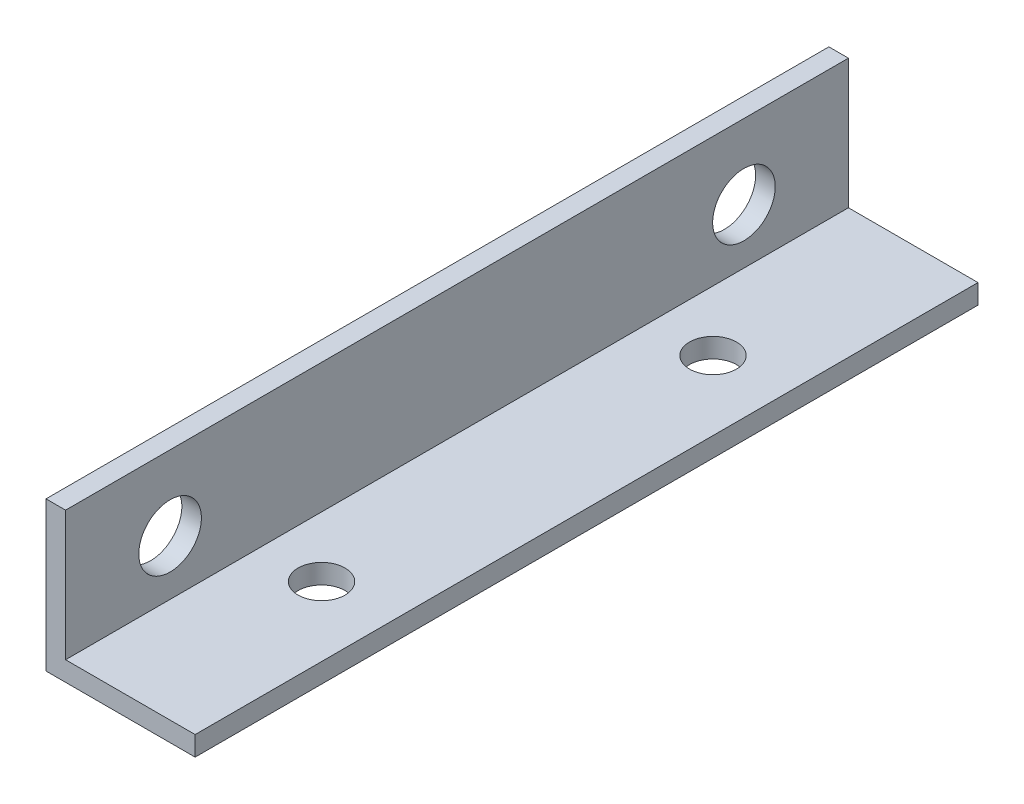
ISO-10303-21;
HEADER;
FILE_DESCRIPTION(('STEP AP214'),'2;1');
FILE_NAME('part.step','',(''),(''),'','','');
FILE_SCHEMA(('AUTOMOTIVE_DESIGN { 1 0 10303 214 1 1 1 1 }'));
ENDSEC;
DATA;
#1=APPLICATION_CONTEXT('core data for automotive mechanical design processes');
#2=APPLICATION_PROTOCOL_DEFINITION('international standard','automotive_design',2000,#1);
#3=PRODUCT_CONTEXT('',#1,'mechanical');
#4=PRODUCT('Part','Part','',(#3));
#5=PRODUCT_RELATED_PRODUCT_CATEGORY('part','',(#4));
#6=PRODUCT_DEFINITION_FORMATION('','',#4);
#7=PRODUCT_DEFINITION_CONTEXT('part definition',#1,'design');
#8=PRODUCT_DEFINITION('design','',#6,#7);
#9=PRODUCT_DEFINITION_SHAPE('','',#8);
#10=(LENGTH_UNIT() NAMED_UNIT(*) SI_UNIT(.MILLI.,.METRE.));
#11=(NAMED_UNIT(*) PLANE_ANGLE_UNIT() SI_UNIT($,.RADIAN.));
#12=(NAMED_UNIT(*) SI_UNIT($,.STERADIAN.) SOLID_ANGLE_UNIT());
#13=UNCERTAINTY_MEASURE_WITH_UNIT(LENGTH_MEASURE(1.E-05),#10,'distance_accuracy_value','');
#14=(GEOMETRIC_REPRESENTATION_CONTEXT(3) GLOBAL_UNCERTAINTY_ASSIGNED_CONTEXT((#13)) GLOBAL_UNIT_ASSIGNED_CONTEXT((#10,
#11,#12)) REPRESENTATION_CONTEXT('',''));
#15=CARTESIAN_POINT('',(0.,0.,0.));
#16=DIRECTION('',(0.,0.,1.));
#17=DIRECTION('',(1.,0.,0.));
#18=AXIS2_PLACEMENT_3D('',#15,#16,#17);
#19=CARTESIAN_POINT('',(2.5,0.,50.));
#20=DIRECTION('',(-1.,0.,0.));
#21=DIRECTION('',(0.,0.,1.));
#22=AXIS2_PLACEMENT_3D('',#19,#20,#21);
#23=PLANE('',#22);
#24=CARTESIAN_POINT('',(2.5,9.52500000000001,36.65));
#25=DIRECTION('',(-1.,0.,0.));
#26=DIRECTION('',(0.,0.,1.));
#27=AXIS2_PLACEMENT_3D('',#24,#25,#26);
#28=CIRCLE('',#27,3.99999999999999);
#29=CARTESIAN_POINT('',(2.5,9.52500000000001,40.65));
#30=VERTEX_POINT('',#29);
#31=EDGE_CURVE('E152',#30,#30,#28,.F.);
#32=ORIENTED_EDGE('',*,*,#31,.F.);
#33=EDGE_LOOP('',(#32));
#34=FACE_BOUND('',#33,.T.);
#35=CARTESIAN_POINT('',(2.5,9.52500000000001,-36.65));
#36=DIRECTION('',(-1.,0.,0.));
#37=DIRECTION('',(0.,0.,1.));
#38=AXIS2_PLACEMENT_3D('',#35,#36,#37);
#39=CIRCLE('',#38,3.99999999999999);
#40=CARTESIAN_POINT('',(2.5,9.52500000000001,-32.65));
#41=VERTEX_POINT('',#40);
#42=EDGE_CURVE('E122',#41,#41,#39,.F.);
#43=ORIENTED_EDGE('',*,*,#42,.F.);
#44=EDGE_LOOP('',(#43));
#45=FACE_BOUND('',#44,.T.);
#46=DIRECTION('',(0.,1.,0.));
#47=VECTOR('',#46,1.);
#48=CARTESIAN_POINT('',(2.5,0.,-50.));
#49=LINE('',#48,#47);
#50=CARTESIAN_POINT('',(2.5,2.5,-50.));
#51=VERTEX_POINT('',#50);
#52=CARTESIAN_POINT('',(2.5,19.05,-50.));
#53=VERTEX_POINT('',#52);
#54=EDGE_CURVE('E118',#51,#53,#49,.T.);
#55=ORIENTED_EDGE('',*,*,#54,.T.);
#56=DIRECTION('',(0.,0.,-1.));
#57=VECTOR('',#56,1.);
#58=CARTESIAN_POINT('',(2.5,19.05,50.));
#59=LINE('',#58,#57);
#60=CARTESIAN_POINT('',(2.5,19.05,50.));
#61=VERTEX_POINT('',#60);
#62=EDGE_CURVE('E11',#61,#53,#59,.T.);
#63=ORIENTED_EDGE('',*,*,#62,.F.);
#64=DIRECTION('',(0.,1.,0.));
#65=VECTOR('',#64,1.);
#66=CARTESIAN_POINT('',(2.5,0.,50.));
#67=LINE('',#66,#65);
#68=CARTESIAN_POINT('',(2.5,2.5,50.));
#69=VERTEX_POINT('',#68);
#70=EDGE_CURVE('E83',#69,#61,#67,.T.);
#71=ORIENTED_EDGE('',*,*,#70,.F.);
#72=DIRECTION('',(0.,0.,-1.));
#73=VECTOR('',#72,1.);
#74=CARTESIAN_POINT('',(2.5,2.5,50.));
#75=LINE('',#74,#73);
#76=EDGE_CURVE('E114',#69,#51,#75,.T.);
#77=ORIENTED_EDGE('',*,*,#76,.T.);
#78=EDGE_LOOP('',(#55,#63,#71,#77));
#79=FACE_BOUND('',#78,.T.);
#80=ADVANCED_FACE('F35',(#34,#45,#79),#23,.F.);
#81=CARTESIAN_POINT('',(0.,19.05,50.));
#82=DIRECTION('',(0.,1.,0.));
#83=DIRECTION('',(0.,0.,1.));
#84=AXIS2_PLACEMENT_3D('',#81,#82,#83);
#85=PLANE('',#84);
#86=DIRECTION('',(1.,0.,0.));
#87=VECTOR('',#86,1.);
#88=CARTESIAN_POINT('',(0.,19.05,-50.));
#89=LINE('',#88,#87);
#90=CARTESIAN_POINT('',(0.,19.05,-50.));
#91=VERTEX_POINT('',#90);
#92=EDGE_CURVE('E121',#91,#53,#89,.T.);
#93=ORIENTED_EDGE('',*,*,#92,.F.);
#94=DIRECTION('',(0.,0.,-1.));
#95=VECTOR('',#94,1.);
#96=CARTESIAN_POINT('',(0.,19.05,50.));
#97=LINE('',#96,#95);
#98=CARTESIAN_POINT('',(0.,19.05,50.));
#99=VERTEX_POINT('',#98);
#100=EDGE_CURVE('E44',#99,#91,#97,.T.);
#101=ORIENTED_EDGE('',*,*,#100,.F.);
#102=DIRECTION('',(1.,0.,0.));
#103=VECTOR('',#102,1.);
#104=CARTESIAN_POINT('',(0.,19.05,50.));
#105=LINE('',#104,#103);
#106=EDGE_CURVE('E161',#99,#61,#105,.T.);
#107=ORIENTED_EDGE('',*,*,#106,.T.);
#108=ORIENTED_EDGE('',*,*,#62,.T.);
#109=EDGE_LOOP('',(#93,#101,#107,#108));
#110=FACE_BOUND('',#109,.T.);
#111=ADVANCED_FACE('F185',(#110),#85,.T.);
#112=CARTESIAN_POINT('',(0.,0.,50.));
#113=DIRECTION('',(-1.,0.,0.));
#114=DIRECTION('',(0.,0.,1.));
#115=AXIS2_PLACEMENT_3D('',#112,#113,#114);
#116=PLANE('',#115);
#117=CARTESIAN_POINT('',(0.,9.52500000000001,36.65));
#118=DIRECTION('',(-1.,0.,0.));
#119=DIRECTION('',(0.,0.,1.));
#120=AXIS2_PLACEMENT_3D('',#117,#118,#119);
#121=CIRCLE('',#120,3.99999999999999);
#122=CARTESIAN_POINT('',(0.,9.52500000000001,40.65));
#123=VERTEX_POINT('',#122);
#124=EDGE_CURVE('E141',#123,#123,#121,.T.);
#125=ORIENTED_EDGE('',*,*,#124,.F.);
#126=EDGE_LOOP('',(#125));
#127=FACE_BOUND('',#126,.T.);
#128=CARTESIAN_POINT('',(0.,9.52500000000001,-36.65));
#129=DIRECTION('',(-1.,0.,0.));
#130=DIRECTION('',(0.,0.,1.));
#131=AXIS2_PLACEMENT_3D('',#128,#129,#130);
#132=CIRCLE('',#131,3.99999999999999);
#133=CARTESIAN_POINT('',(0.,9.52500000000001,-32.65));
#134=VERTEX_POINT('',#133);
#135=EDGE_CURVE('E155',#134,#134,#132,.T.);
#136=ORIENTED_EDGE('',*,*,#135,.F.);
#137=EDGE_LOOP('',(#136));
#138=FACE_BOUND('',#137,.T.);
#139=DIRECTION('',(0.,1.,0.));
#140=VECTOR('',#139,1.);
#141=CARTESIAN_POINT('',(0.,0.,-50.));
#142=LINE('',#141,#140);
#143=CARTESIAN_POINT('',(0.,0.,-50.));
#144=VERTEX_POINT('',#143);
#145=EDGE_CURVE('E125',#144,#91,#142,.T.);
#146=ORIENTED_EDGE('',*,*,#145,.F.);
#147=DIRECTION('',(0.,0.,-1.));
#148=VECTOR('',#147,1.);
#149=CARTESIAN_POINT('',(0.,0.,50.));
#150=LINE('',#149,#148);
#151=CARTESIAN_POINT('',(0.,0.,50.));
#152=VERTEX_POINT('',#151);
#153=EDGE_CURVE('E104',#152,#144,#150,.T.);
#154=ORIENTED_EDGE('',*,*,#153,.F.);
#155=DIRECTION('',(0.,1.,0.));
#156=VECTOR('',#155,1.);
#157=CARTESIAN_POINT('',(0.,0.,50.));
#158=LINE('',#157,#156);
#159=EDGE_CURVE('E110',#152,#99,#158,.T.);
#160=ORIENTED_EDGE('',*,*,#159,.T.);
#161=ORIENTED_EDGE('',*,*,#100,.T.);
#162=EDGE_LOOP('',(#146,#154,#160,#161));
#163=FACE_BOUND('',#162,.T.);
#164=ADVANCED_FACE('F165',(#127,#138,#163),#116,.T.);
#165=CARTESIAN_POINT('',(19.05,0.,50.));
#166=DIRECTION('',(0.,-1.,0.));
#167=DIRECTION('',(0.,0.,-1.));
#168=AXIS2_PLACEMENT_3D('',#165,#166,#167);
#169=PLANE('',#168);
#170=CARTESIAN_POINT('',(10.2,0.,25.));
#171=DIRECTION('',(0.,-1.,0.));
#172=DIRECTION('',(0.,0.,-1.));
#173=AXIS2_PLACEMENT_3D('',#170,#171,#172);
#174=CIRCLE('',#173,3.);
#175=CARTESIAN_POINT('',(10.2,0.,22.));
#176=VERTEX_POINT('',#175);
#177=EDGE_CURVE('E137',#176,#176,#174,.T.);
#178=ORIENTED_EDGE('',*,*,#177,.F.);
#179=EDGE_LOOP('',(#178));
#180=FACE_BOUND('',#179,.T.);
#181=CARTESIAN_POINT('',(10.2,0.,-25.));
#182=DIRECTION('',(0.,-1.,0.));
#183=DIRECTION('',(0.,0.,-1.));
#184=AXIS2_PLACEMENT_3D('',#181,#182,#183);
#185=CIRCLE('',#184,3.);
#186=CARTESIAN_POINT('',(10.2,0.,-28.));
#187=VERTEX_POINT('',#186);
#188=EDGE_CURVE('E143',#187,#187,#185,.T.);
#189=ORIENTED_EDGE('',*,*,#188,.F.);
#190=EDGE_LOOP('',(#189));
#191=FACE_BOUND('',#190,.T.);
#192=DIRECTION('',(-1.,0.,0.));
#193=VECTOR('',#192,1.);
#194=CARTESIAN_POINT('',(19.05,0.,-50.));
#195=LINE('',#194,#193);
#196=CARTESIAN_POINT('',(19.05,0.,-50.));
#197=VERTEX_POINT('',#196);
#198=EDGE_CURVE('E99',#197,#144,#195,.T.);
#199=ORIENTED_EDGE('',*,*,#198,.F.);
#200=DIRECTION('',(0.,0.,-1.));
#201=VECTOR('',#200,1.);
#202=CARTESIAN_POINT('',(19.05,0.,50.));
#203=LINE('',#202,#201);
#204=CARTESIAN_POINT('',(19.05,0.,50.));
#205=VERTEX_POINT('',#204);
#206=EDGE_CURVE('E94',#205,#197,#203,.T.);
#207=ORIENTED_EDGE('',*,*,#206,.F.);
#208=DIRECTION('',(-1.,0.,0.));
#209=VECTOR('',#208,1.);
#210=CARTESIAN_POINT('',(19.05,0.,50.));
#211=LINE('',#210,#209);
#212=EDGE_CURVE('E97',#205,#152,#211,.T.);
#213=ORIENTED_EDGE('',*,*,#212,.T.);
#214=ORIENTED_EDGE('',*,*,#153,.T.);
#215=EDGE_LOOP('',(#199,#207,#213,#214));
#216=FACE_BOUND('',#215,.T.);
#217=ADVANCED_FACE('F96',(#180,#191,#216),#169,.T.);
#218=CARTESIAN_POINT('',(19.05,2.5,50.));
#219=DIRECTION('',(1.,0.,0.));
#220=DIRECTION('',(0.,0.,-1.));
#221=AXIS2_PLACEMENT_3D('',#218,#219,#220);
#222=PLANE('',#221);
#223=DIRECTION('',(0.,-1.,0.));
#224=VECTOR('',#223,1.);
#225=CARTESIAN_POINT('',(19.05,2.5,-50.));
#226=LINE('',#225,#224);
#227=CARTESIAN_POINT('',(19.05,2.5,-50.));
#228=VERTEX_POINT('',#227);
#229=EDGE_CURVE('E129',#228,#197,#226,.T.);
#230=ORIENTED_EDGE('',*,*,#229,.F.);
#231=DIRECTION('',(0.,0.,-1.));
#232=VECTOR('',#231,1.);
#233=CARTESIAN_POINT('',(19.05,2.5,50.));
#234=LINE('',#233,#232);
#235=CARTESIAN_POINT('',(19.05,2.5,50.));
#236=VERTEX_POINT('',#235);
#237=EDGE_CURVE('E74',#236,#228,#234,.T.);
#238=ORIENTED_EDGE('',*,*,#237,.F.);
#239=DIRECTION('',(0.,-1.,0.));
#240=VECTOR('',#239,1.);
#241=CARTESIAN_POINT('',(19.05,2.5,50.));
#242=LINE('',#241,#240);
#243=EDGE_CURVE('E108',#236,#205,#242,.T.);
#244=ORIENTED_EDGE('',*,*,#243,.T.);
#245=ORIENTED_EDGE('',*,*,#206,.T.);
#246=EDGE_LOOP('',(#230,#238,#244,#245));
#247=FACE_BOUND('',#246,.T.);
#248=ADVANCED_FACE('F112',(#247),#222,.T.);
#249=CARTESIAN_POINT('',(19.05,2.5,50.));
#250=DIRECTION('',(0.,-1.,0.));
#251=DIRECTION('',(0.,0.,-1.));
#252=AXIS2_PLACEMENT_3D('',#249,#250,#251);
#253=PLANE('',#252);
#254=CARTESIAN_POINT('',(10.2,2.5,25.));
#255=DIRECTION('',(0.,-1.,0.));
#256=DIRECTION('',(0.,0.,-1.));
#257=AXIS2_PLACEMENT_3D('',#254,#255,#256);
#258=CIRCLE('',#257,3.);
#259=CARTESIAN_POINT('',(10.2,2.5,22.));
#260=VERTEX_POINT('',#259);
#261=EDGE_CURVE('E38',#260,#260,#258,.T.);
#262=ORIENTED_EDGE('',*,*,#261,.T.);
#263=EDGE_LOOP('',(#262));
#264=FACE_BOUND('',#263,.T.);
#265=CARTESIAN_POINT('',(10.2,2.5,-25.));
#266=DIRECTION('',(0.,-1.,0.));
#267=DIRECTION('',(0.,0.,-1.));
#268=AXIS2_PLACEMENT_3D('',#265,#266,#267);
#269=CIRCLE('',#268,3.);
#270=CARTESIAN_POINT('',(10.2,2.5,-28.));
#271=VERTEX_POINT('',#270);
#272=EDGE_CURVE('E135',#271,#271,#269,.T.);
#273=ORIENTED_EDGE('',*,*,#272,.T.);
#274=EDGE_LOOP('',(#273));
#275=FACE_BOUND('',#274,.T.);
#276=DIRECTION('',(1.,0.,0.));
#277=VECTOR('',#276,1.);
#278=CARTESIAN_POINT('',(19.05,2.5,-50.));
#279=LINE('',#278,#277);
#280=EDGE_CURVE('E77',#228,#51,#279,.F.);
#281=ORIENTED_EDGE('',*,*,#280,.T.);
#282=ORIENTED_EDGE('',*,*,#76,.F.);
#283=DIRECTION('',(1.,0.,0.));
#284=VECTOR('',#283,1.);
#285=CARTESIAN_POINT('',(19.05,2.5,50.));
#286=LINE('',#285,#284);
#287=EDGE_CURVE('E53',#236,#69,#286,.F.);
#288=ORIENTED_EDGE('',*,*,#287,.F.);
#289=ORIENTED_EDGE('',*,*,#237,.T.);
#290=EDGE_LOOP('',(#281,#282,#288,#289));
#291=FACE_BOUND('',#290,.T.);
#292=ADVANCED_FACE('F171',(#264,#275,#291),#253,.F.);
#293=CARTESIAN_POINT('',(0.,0.,50.));
#294=DIRECTION('',(0.,0.,-1.));
#295=DIRECTION('',(-1.,0.,0.));
#296=AXIS2_PLACEMENT_3D('',#293,#294,#295);
#297=PLANE('',#296);
#298=ORIENTED_EDGE('',*,*,#70,.T.);
#299=ORIENTED_EDGE('',*,*,#106,.F.);
#300=ORIENTED_EDGE('',*,*,#159,.F.);
#301=ORIENTED_EDGE('',*,*,#212,.F.);
#302=ORIENTED_EDGE('',*,*,#243,.F.);
#303=ORIENTED_EDGE('',*,*,#287,.T.);
#304=EDGE_LOOP('',(#298,#299,#300,#301,#302,#303));
#305=FACE_BOUND('',#304,.T.);
#306=ADVANCED_FACE('F107',(#305),#297,.F.);
#307=CARTESIAN_POINT('',(0.,0.,-50.));
#308=DIRECTION('',(0.,0.,-1.));
#309=DIRECTION('',(-1.,0.,0.));
#310=AXIS2_PLACEMENT_3D('',#307,#308,#309);
#311=PLANE('',#310);
#312=ORIENTED_EDGE('',*,*,#54,.F.);
#313=ORIENTED_EDGE('',*,*,#280,.F.);
#314=ORIENTED_EDGE('',*,*,#229,.T.);
#315=ORIENTED_EDGE('',*,*,#198,.T.);
#316=ORIENTED_EDGE('',*,*,#145,.T.);
#317=ORIENTED_EDGE('',*,*,#92,.T.);
#318=EDGE_LOOP('',(#312,#313,#314,#315,#316,#317));
#319=FACE_BOUND('',#318,.T.);
#320=ADVANCED_FACE('F169',(#319),#311,.T.);
#321=CARTESIAN_POINT('',(19.051,9.52500000000001,-36.65));
#322=DIRECTION('',(-1.,0.,0.));
#323=DIRECTION('',(0.,0.,1.));
#324=AXIS2_PLACEMENT_3D('',#321,#322,#323);
#325=CYLINDRICAL_SURFACE('',#324,3.99999999999999);
#326=ORIENTED_EDGE('',*,*,#135,.T.);
#327=EDGE_LOOP('',(#326));
#328=FACE_BOUND('',#327,.T.);
#329=ORIENTED_EDGE('',*,*,#42,.T.);
#330=EDGE_LOOP('',(#329));
#331=FACE_BOUND('',#330,.T.);
#332=ADVANCED_FACE('F195',(#328,#331),#325,.F.);
#333=CARTESIAN_POINT('',(19.051,9.52500000000001,36.65));
#334=DIRECTION('',(-1.,0.,0.));
#335=DIRECTION('',(0.,0.,1.));
#336=AXIS2_PLACEMENT_3D('',#333,#334,#335);
#337=CYLINDRICAL_SURFACE('',#336,3.99999999999999);
#338=ORIENTED_EDGE('',*,*,#124,.T.);
#339=EDGE_LOOP('',(#338));
#340=FACE_BOUND('',#339,.T.);
#341=ORIENTED_EDGE('',*,*,#31,.T.);
#342=EDGE_LOOP('',(#341));
#343=FACE_BOUND('',#342,.T.);
#344=ADVANCED_FACE('F197',(#340,#343),#337,.F.);
#345=CARTESIAN_POINT('',(10.2,19.05,-25.));
#346=DIRECTION('',(0.,-1.,0.));
#347=DIRECTION('',(0.,0.,-1.));
#348=AXIS2_PLACEMENT_3D('',#345,#346,#347);
#349=CYLINDRICAL_SURFACE('',#348,3.);
#350=CARTESIAN_POINT('',(10.2,0.,-28.));
#351=CARTESIAN_POINT('',(10.2,0.0260416666666661,-28.));
#352=CARTESIAN_POINT('',(10.2,0.0520833333333322,-28.));
#353=CARTESIAN_POINT('',(10.2,0.104166666666666,-28.));
#354=CARTESIAN_POINT('',(10.2,0.130208333333333,-28.));
#355=CARTESIAN_POINT('',(10.2,0.182291666666667,-28.));
#356=CARTESIAN_POINT('',(10.2,0.208333333333335,-28.));
#357=CARTESIAN_POINT('',(10.2,0.260416666666668,-28.));
#358=CARTESIAN_POINT('',(10.2,0.286458333333334,-28.));
#359=CARTESIAN_POINT('',(10.2,0.338541666666666,-28.));
#360=CARTESIAN_POINT('',(10.2,0.364583333333332,-28.));
#361=CARTESIAN_POINT('',(10.2,0.416666666666666,-28.));
#362=CARTESIAN_POINT('',(10.2,0.442708333333333,-28.));
#363=CARTESIAN_POINT('',(10.2,0.494791666666668,-28.));
#364=CARTESIAN_POINT('',(10.2,0.520833333333335,-28.));
#365=CARTESIAN_POINT('',(10.2,0.572916666666668,-28.));
#366=CARTESIAN_POINT('',(10.2,0.598958333333334,-28.));
#367=CARTESIAN_POINT('',(10.2,0.651041666666667,-28.));
#368=CARTESIAN_POINT('',(10.2,0.677083333333333,-28.));
#369=CARTESIAN_POINT('',(10.2,0.729166666666666,-28.));
#370=CARTESIAN_POINT('',(10.2,0.755208333333333,-28.));
#371=CARTESIAN_POINT('',(10.2,0.807291666666668,-28.));
#372=CARTESIAN_POINT('',(10.2,0.833333333333335,-28.));
#373=CARTESIAN_POINT('',(10.2,0.885416666666669,-28.));
#374=CARTESIAN_POINT('',(10.2,0.911458333333335,-28.));
#375=CARTESIAN_POINT('',(10.2,0.963541666666667,-28.));
#376=CARTESIAN_POINT('',(10.2,0.989583333333333,-28.));
#377=CARTESIAN_POINT('',(10.2,1.04166666666667,-28.));
#378=CARTESIAN_POINT('',(10.2,1.06770833333333,-28.));
#379=CARTESIAN_POINT('',(10.2,1.11979166666667,-28.));
#380=CARTESIAN_POINT('',(10.2,1.14583333333334,-28.));
#381=CARTESIAN_POINT('',(10.2,1.19791666666667,-28.));
#382=CARTESIAN_POINT('',(10.2,1.22395833333334,-28.));
#383=CARTESIAN_POINT('',(10.2,1.27604166666667,-28.));
#384=CARTESIAN_POINT('',(10.2,1.30208333333333,-28.));
#385=CARTESIAN_POINT('',(10.2,1.35416666666667,-28.));
#386=CARTESIAN_POINT('',(10.2,1.38020833333333,-28.));
#387=CARTESIAN_POINT('',(10.2,1.43229166666667,-28.));
#388=CARTESIAN_POINT('',(10.2,1.45833333333334,-28.));
#389=CARTESIAN_POINT('',(10.2,1.51041666666667,-28.));
#390=CARTESIAN_POINT('',(10.2,1.53645833333334,-28.));
#391=CARTESIAN_POINT('',(10.2,1.58854166666667,-28.));
#392=CARTESIAN_POINT('',(10.2,1.61458333333333,-28.));
#393=CARTESIAN_POINT('',(10.2,1.66666666666667,-28.));
#394=CARTESIAN_POINT('',(10.2,1.69270833333333,-28.));
#395=CARTESIAN_POINT('',(10.2,1.74479166666667,-28.));
#396=CARTESIAN_POINT('',(10.2,1.77083333333334,-28.));
#397=CARTESIAN_POINT('',(10.2,1.82291666666667,-28.));
#398=CARTESIAN_POINT('',(10.2,1.84895833333334,-28.));
#399=CARTESIAN_POINT('',(10.2,1.90104166666667,-28.));
#400=CARTESIAN_POINT('',(10.2,1.92708333333333,-28.));
#401=CARTESIAN_POINT('',(10.2,1.97916666666667,-28.));
#402=CARTESIAN_POINT('',(10.2,2.00520833333333,-28.));
#403=CARTESIAN_POINT('',(10.2,2.05729166666667,-28.));
#404=CARTESIAN_POINT('',(10.2,2.08333333333334,-28.));
#405=CARTESIAN_POINT('',(10.2,2.13541666666667,-28.));
#406=CARTESIAN_POINT('',(10.2,2.16145833333334,-28.));
#407=CARTESIAN_POINT('',(10.2,2.21354166666667,-28.));
#408=CARTESIAN_POINT('',(10.2,2.23958333333333,-28.));
#409=CARTESIAN_POINT('',(10.2,2.29166666666667,-28.));
#410=CARTESIAN_POINT('',(10.2,2.31770833333333,-28.));
#411=CARTESIAN_POINT('',(10.2,2.36979166666667,-28.));
#412=CARTESIAN_POINT('',(10.2,2.39583333333334,-28.));
#413=CARTESIAN_POINT('',(10.2,2.44791666666667,-28.));
#414=CARTESIAN_POINT('',(10.2,2.47395833333334,-28.));
#415=CARTESIAN_POINT('',(10.2,2.5,-28.));
#416=B_SPLINE_CURVE_WITH_KNOTS('',3,(#350,#351,#352,#353,#354,#355,#356,#357,#358,#359,#360,
#361,#362,#363,#364,#365,#366,#367,#368,#369,#370,#371,#372,#373,#374,#375,#376,#377,#378,#379,
#380,#381,#382,#383,#384,#385,#386,#387,#388,#389,#390,#391,#392,#393,#394,#395,#396,#397,#398,
#399,#400,#401,#402,#403,#404,#405,#406,#407,#408,#409,#410,#411,#412,#413,#414,#415),
.UNSPECIFIED.,.F.,.F.,(4,2,2,2,2,2,2,2,2,2,2,2,2,2,2,2,2,2,2,2,2,2,2,2,2,2,2,2,2,2,2,2,4),(0.,
0.0781249999999983,0.15625,0.234375000000002,0.3125,0.390624999999999,0.46875,0.546875000000002,
0.625000000000001,0.703124999999999,0.781250000000001,0.859375000000002,0.937500000000001,
1.015625,1.09375,1.171875,1.25,1.328125,1.40625,1.484375,1.5625,1.640625,1.71875,1.796875,1.875,
1.953125,2.03125,2.109375,2.1875,2.265625,2.34375,2.421875,2.5),.UNSPECIFIED.);
#417=EDGE_CURVE('BSEAM204',#187,#271,#416,.T.);
#418=ORIENTED_EDGE('',*,*,#188,.T.);
#419=ORIENTED_EDGE('',*,*,#272,.F.);
#420=ORIENTED_EDGE('',*,*,#417,.T.);
#421=ORIENTED_EDGE('',*,*,#417,.F.);
#422=EDGE_LOOP('',(#418,#420,#419,#421));
#423=FACE_BOUND('',#422,.T.);
#424=ADVANCED_FACE('F204',(#423),#349,.F.);
#425=CARTESIAN_POINT('',(10.2,19.05,25.));
#426=DIRECTION('',(0.,-1.,0.));
#427=DIRECTION('',(0.,0.,-1.));
#428=AXIS2_PLACEMENT_3D('',#425,#426,#427);
#429=CYLINDRICAL_SURFACE('',#428,3.);
#430=CARTESIAN_POINT('',(10.2,0.,22.));
#431=CARTESIAN_POINT('',(10.2,0.0260416666666661,22.));
#432=CARTESIAN_POINT('',(10.2,0.0520833333333322,22.));
#433=CARTESIAN_POINT('',(10.2,0.104166666666666,22.));
#434=CARTESIAN_POINT('',(10.2,0.130208333333333,22.));
#435=CARTESIAN_POINT('',(10.2,0.182291666666667,22.));
#436=CARTESIAN_POINT('',(10.2,0.208333333333335,22.));
#437=CARTESIAN_POINT('',(10.2,0.260416666666668,22.));
#438=CARTESIAN_POINT('',(10.2,0.286458333333334,22.));
#439=CARTESIAN_POINT('',(10.2,0.338541666666666,22.));
#440=CARTESIAN_POINT('',(10.2,0.364583333333332,22.));
#441=CARTESIAN_POINT('',(10.2,0.416666666666666,22.));
#442=CARTESIAN_POINT('',(10.2,0.442708333333333,22.));
#443=CARTESIAN_POINT('',(10.2,0.494791666666668,22.));
#444=CARTESIAN_POINT('',(10.2,0.520833333333335,22.));
#445=CARTESIAN_POINT('',(10.2,0.572916666666668,22.));
#446=CARTESIAN_POINT('',(10.2,0.598958333333334,22.));
#447=CARTESIAN_POINT('',(10.2,0.651041666666667,22.));
#448=CARTESIAN_POINT('',(10.2,0.677083333333333,22.));
#449=CARTESIAN_POINT('',(10.2,0.729166666666666,22.));
#450=CARTESIAN_POINT('',(10.2,0.755208333333333,22.));
#451=CARTESIAN_POINT('',(10.2,0.807291666666668,22.));
#452=CARTESIAN_POINT('',(10.2,0.833333333333335,22.));
#453=CARTESIAN_POINT('',(10.2,0.885416666666669,22.));
#454=CARTESIAN_POINT('',(10.2,0.911458333333335,22.));
#455=CARTESIAN_POINT('',(10.2,0.963541666666667,22.));
#456=CARTESIAN_POINT('',(10.2,0.989583333333333,22.));
#457=CARTESIAN_POINT('',(10.2,1.04166666666667,22.));
#458=CARTESIAN_POINT('',(10.2,1.06770833333333,22.));
#459=CARTESIAN_POINT('',(10.2,1.11979166666667,22.));
#460=CARTESIAN_POINT('',(10.2,1.14583333333334,22.));
#461=CARTESIAN_POINT('',(10.2,1.19791666666667,22.));
#462=CARTESIAN_POINT('',(10.2,1.22395833333334,22.));
#463=CARTESIAN_POINT('',(10.2,1.27604166666667,22.));
#464=CARTESIAN_POINT('',(10.2,1.30208333333333,22.));
#465=CARTESIAN_POINT('',(10.2,1.35416666666667,22.));
#466=CARTESIAN_POINT('',(10.2,1.38020833333333,22.));
#467=CARTESIAN_POINT('',(10.2,1.43229166666667,22.));
#468=CARTESIAN_POINT('',(10.2,1.45833333333334,22.));
#469=CARTESIAN_POINT('',(10.2,1.51041666666667,22.));
#470=CARTESIAN_POINT('',(10.2,1.53645833333334,22.));
#471=CARTESIAN_POINT('',(10.2,1.58854166666667,22.));
#472=CARTESIAN_POINT('',(10.2,1.61458333333333,22.));
#473=CARTESIAN_POINT('',(10.2,1.66666666666667,22.));
#474=CARTESIAN_POINT('',(10.2,1.69270833333333,22.));
#475=CARTESIAN_POINT('',(10.2,1.74479166666667,22.));
#476=CARTESIAN_POINT('',(10.2,1.77083333333334,22.));
#477=CARTESIAN_POINT('',(10.2,1.82291666666667,22.));
#478=CARTESIAN_POINT('',(10.2,1.84895833333334,22.));
#479=CARTESIAN_POINT('',(10.2,1.90104166666667,22.));
#480=CARTESIAN_POINT('',(10.2,1.92708333333333,22.));
#481=CARTESIAN_POINT('',(10.2,1.97916666666667,22.));
#482=CARTESIAN_POINT('',(10.2,2.00520833333333,22.));
#483=CARTESIAN_POINT('',(10.2,2.05729166666667,22.));
#484=CARTESIAN_POINT('',(10.2,2.08333333333334,22.));
#485=CARTESIAN_POINT('',(10.2,2.13541666666667,22.));
#486=CARTESIAN_POINT('',(10.2,2.16145833333334,22.));
#487=CARTESIAN_POINT('',(10.2,2.21354166666667,22.));
#488=CARTESIAN_POINT('',(10.2,2.23958333333333,22.));
#489=CARTESIAN_POINT('',(10.2,2.29166666666667,22.));
#490=CARTESIAN_POINT('',(10.2,2.31770833333333,22.));
#491=CARTESIAN_POINT('',(10.2,2.36979166666667,22.));
#492=CARTESIAN_POINT('',(10.2,2.39583333333334,22.));
#493=CARTESIAN_POINT('',(10.2,2.44791666666667,22.));
#494=CARTESIAN_POINT('',(10.2,2.47395833333334,22.));
#495=CARTESIAN_POINT('',(10.2,2.5,22.));
#496=B_SPLINE_CURVE_WITH_KNOTS('',3,(#430,#431,#432,#433,#434,#435,#436,#437,#438,#439,#440,
#441,#442,#443,#444,#445,#446,#447,#448,#449,#450,#451,#452,#453,#454,#455,#456,#457,#458,#459,
#460,#461,#462,#463,#464,#465,#466,#467,#468,#469,#470,#471,#472,#473,#474,#475,#476,#477,#478,
#479,#480,#481,#482,#483,#484,#485,#486,#487,#488,#489,#490,#491,#492,#493,#494,#495),
.UNSPECIFIED.,.F.,.F.,(4,2,2,2,2,2,2,2,2,2,2,2,2,2,2,2,2,2,2,2,2,2,2,2,2,2,2,2,2,2,2,2,4),(0.,
0.0781249999999983,0.15625,0.234375000000002,0.3125,0.390624999999999,0.46875,0.546875000000002,
0.625000000000001,0.703124999999999,0.781250000000001,0.859375000000002,0.937500000000001,
1.015625,1.09375,1.171875,1.25,1.328125,1.40625,1.484375,1.5625,1.640625,1.71875,1.796875,1.875,
1.953125,2.03125,2.109375,2.1875,2.265625,2.34375,2.421875,2.5),.UNSPECIFIED.);
#497=EDGE_CURVE('BSEAM210',#176,#260,#496,.T.);
#498=ORIENTED_EDGE('',*,*,#177,.T.);
#499=ORIENTED_EDGE('',*,*,#261,.F.);
#500=ORIENTED_EDGE('',*,*,#497,.T.);
#501=ORIENTED_EDGE('',*,*,#497,.F.);
#502=EDGE_LOOP('',(#498,#500,#499,#501));
#503=FACE_BOUND('',#502,.T.);
#504=ADVANCED_FACE('F210',(#503),#429,.F.);
#505=CLOSED_SHELL('',(#80,#111,#164,#217,#248,#292,#306,#320,#332,#344,#424,#504));
#506=MANIFOLD_SOLID_BREP('B2',#505);
#507=ADVANCED_BREP_SHAPE_REPRESENTATION('',(#18,#506),#14);
#508=SHAPE_DEFINITION_REPRESENTATION(#9,#507);
ENDSEC;
END-ISO-10303-21;
